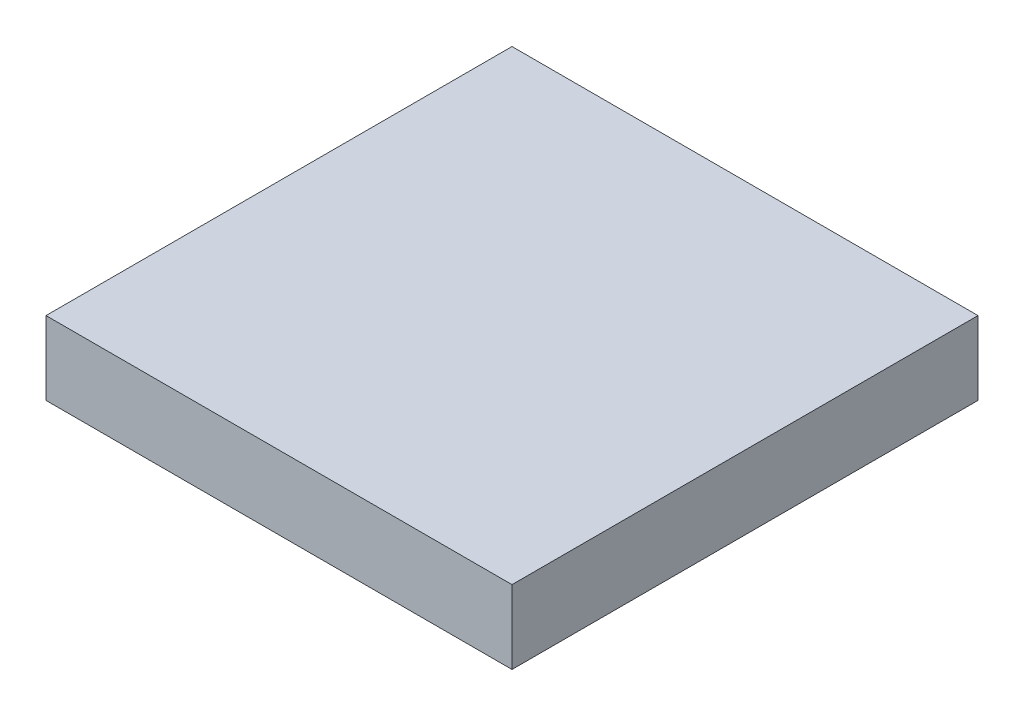
ISO-10303-21;
HEADER;
FILE_DESCRIPTION(('STEP AP214'),'2;1');
FILE_NAME('part.step','',(''),(''),'','','');
FILE_SCHEMA(('AUTOMOTIVE_DESIGN { 1 0 10303 214 1 1 1 1 }'));
ENDSEC;
DATA;
#1=APPLICATION_CONTEXT('core data for automotive mechanical design processes');
#2=APPLICATION_PROTOCOL_DEFINITION('international standard','automotive_design',2000,#1);
#3=PRODUCT_CONTEXT('',#1,'mechanical');
#4=PRODUCT('Part','Part','',(#3));
#5=PRODUCT_RELATED_PRODUCT_CATEGORY('part','',(#4));
#6=PRODUCT_DEFINITION_FORMATION('','',#4);
#7=PRODUCT_DEFINITION_CONTEXT('part definition',#1,'design');
#8=PRODUCT_DEFINITION('design','',#6,#7);
#9=PRODUCT_DEFINITION_SHAPE('','',#8);
#10=(LENGTH_UNIT() NAMED_UNIT(*) SI_UNIT(.MILLI.,.METRE.));
#11=(NAMED_UNIT(*) PLANE_ANGLE_UNIT() SI_UNIT($,.RADIAN.));
#12=(NAMED_UNIT(*) SI_UNIT($,.STERADIAN.) SOLID_ANGLE_UNIT());
#13=UNCERTAINTY_MEASURE_WITH_UNIT(LENGTH_MEASURE(1.E-05),#10,'distance_accuracy_value','');
#14=(GEOMETRIC_REPRESENTATION_CONTEXT(3) GLOBAL_UNCERTAINTY_ASSIGNED_CONTEXT((#13)) GLOBAL_UNIT_ASSIGNED_CONTEXT((#10,
#11,#12)) REPRESENTATION_CONTEXT('',''));
#15=CARTESIAN_POINT('',(0.,0.,0.));
#16=DIRECTION('',(0.,0.,1.));
#17=DIRECTION('',(1.,0.,0.));
#18=AXIS2_PLACEMENT_3D('',#15,#16,#17);
#19=CARTESIAN_POINT('',(14.9,4.7,14.9));
#20=DIRECTION('',(-1.,0.,0.));
#21=DIRECTION('',(0.,0.,1.));
#22=AXIS2_PLACEMENT_3D('',#19,#20,#21);
#23=PLANE('',#22);
#24=DIRECTION('',(0.,0.,-1.));
#25=VECTOR('',#24,1.);
#26=CARTESIAN_POINT('',(14.9,0.,14.9));
#27=LINE('',#26,#25);
#28=CARTESIAN_POINT('',(14.9,0.,14.9));
#29=VERTEX_POINT('',#28);
#30=CARTESIAN_POINT('',(14.9,0.,-14.9));
#31=VERTEX_POINT('',#30);
#32=EDGE_CURVE('E111',#29,#31,#27,.T.);
#33=ORIENTED_EDGE('',*,*,#32,.T.);
#34=DIRECTION('',(0.,-1.,0.));
#35=VECTOR('',#34,1.);
#36=CARTESIAN_POINT('',(14.9,4.7,-14.9));
#37=LINE('',#36,#35);
#38=CARTESIAN_POINT('',(14.9,4.7,-14.9));
#39=VERTEX_POINT('',#38);
#40=EDGE_CURVE('E11',#39,#31,#37,.T.);
#41=ORIENTED_EDGE('',*,*,#40,.F.);
#42=DIRECTION('',(0.,0.,-1.));
#43=VECTOR('',#42,1.);
#44=CARTESIAN_POINT('',(14.9,4.7,14.9));
#45=LINE('',#44,#43);
#46=CARTESIAN_POINT('',(14.9,4.7,14.9));
#47=VERTEX_POINT('',#46);
#48=EDGE_CURVE('E95',#47,#39,#45,.T.);
#49=ORIENTED_EDGE('',*,*,#48,.F.);
#50=DIRECTION('',(0.,-1.,0.));
#51=VECTOR('',#50,1.);
#52=CARTESIAN_POINT('',(14.9,4.7,14.9));
#53=LINE('',#52,#51);
#54=EDGE_CURVE('E107',#47,#29,#53,.T.);
#55=ORIENTED_EDGE('',*,*,#54,.T.);
#56=EDGE_LOOP('',(#33,#41,#49,#55));
#57=FACE_BOUND('',#56,.T.);
#58=ADVANCED_FACE('F43',(#57),#23,.F.);
#59=CARTESIAN_POINT('',(-14.9,4.7,-14.9));
#60=DIRECTION('',(0.,0.,1.));
#61=DIRECTION('',(1.,0.,0.));
#62=AXIS2_PLACEMENT_3D('',#59,#60,#61);
#63=PLANE('',#62);
#64=DIRECTION('',(-1.,0.,0.));
#65=VECTOR('',#64,1.);
#66=CARTESIAN_POINT('',(-14.9,0.,-14.9));
#67=LINE('',#66,#65);
#68=CARTESIAN_POINT('',(-14.9,0.,-14.9));
#69=VERTEX_POINT('',#68);
#70=EDGE_CURVE('E100',#31,#69,#67,.T.);
#71=ORIENTED_EDGE('',*,*,#70,.T.);
#72=DIRECTION('',(0.,-1.,0.));
#73=VECTOR('',#72,1.);
#74=CARTESIAN_POINT('',(-14.9,4.7,-14.9));
#75=LINE('',#74,#73);
#76=CARTESIAN_POINT('',(-14.9,4.7,-14.9));
#77=VERTEX_POINT('',#76);
#78=EDGE_CURVE('E52',#77,#69,#75,.T.);
#79=ORIENTED_EDGE('',*,*,#78,.F.);
#80=DIRECTION('',(-1.,0.,0.));
#81=VECTOR('',#80,1.);
#82=CARTESIAN_POINT('',(-14.9,4.7,-14.9));
#83=LINE('',#82,#81);
#84=EDGE_CURVE('E90',#39,#77,#83,.T.);
#85=ORIENTED_EDGE('',*,*,#84,.F.);
#86=ORIENTED_EDGE('',*,*,#40,.T.);
#87=EDGE_LOOP('',(#71,#79,#85,#86));
#88=FACE_BOUND('',#87,.T.);
#89=ADVANCED_FACE('F99',(#88),#63,.F.);
#90=CARTESIAN_POINT('',(-14.9,4.7,14.9));
#91=DIRECTION('',(1.,0.,0.));
#92=DIRECTION('',(0.,0.,-1.));
#93=AXIS2_PLACEMENT_3D('',#90,#91,#92);
#94=PLANE('',#93);
#95=DIRECTION('',(0.,0.,1.));
#96=VECTOR('',#95,1.);
#97=CARTESIAN_POINT('',(-14.9,0.,14.9));
#98=LINE('',#97,#96);
#99=CARTESIAN_POINT('',(-14.9,0.,14.9));
#100=VERTEX_POINT('',#99);
#101=EDGE_CURVE('E77',#69,#100,#98,.T.);
#102=ORIENTED_EDGE('',*,*,#101,.T.);
#103=DIRECTION('',(0.,-1.,0.));
#104=VECTOR('',#103,1.);
#105=CARTESIAN_POINT('',(-14.9,4.7,14.9));
#106=LINE('',#105,#104);
#107=CARTESIAN_POINT('',(-14.9,4.7,14.9));
#108=VERTEX_POINT('',#107);
#109=EDGE_CURVE('E102',#108,#100,#106,.T.);
#110=ORIENTED_EDGE('',*,*,#109,.F.);
#111=DIRECTION('',(0.,0.,1.));
#112=VECTOR('',#111,1.);
#113=CARTESIAN_POINT('',(-14.9,4.7,14.9));
#114=LINE('',#113,#112);
#115=EDGE_CURVE('E93',#77,#108,#114,.T.);
#116=ORIENTED_EDGE('',*,*,#115,.F.);
#117=ORIENTED_EDGE('',*,*,#78,.T.);
#118=EDGE_LOOP('',(#102,#110,#116,#117));
#119=FACE_BOUND('',#118,.T.);
#120=ADVANCED_FACE('F103',(#119),#94,.F.);
#121=CARTESIAN_POINT('',(-14.9,4.7,14.9));
#122=DIRECTION('',(0.,0.,-1.));
#123=DIRECTION('',(-1.,0.,0.));
#124=AXIS2_PLACEMENT_3D('',#121,#122,#123);
#125=PLANE('',#124);
#126=DIRECTION('',(1.,0.,0.));
#127=VECTOR('',#126,1.);
#128=CARTESIAN_POINT('',(-14.9,0.,14.9));
#129=LINE('',#128,#127);
#130=EDGE_CURVE('E83',#100,#29,#129,.T.);
#131=ORIENTED_EDGE('',*,*,#130,.T.);
#132=ORIENTED_EDGE('',*,*,#54,.F.);
#133=DIRECTION('',(1.,0.,0.));
#134=VECTOR('',#133,1.);
#135=CARTESIAN_POINT('',(-14.9,4.7,14.9));
#136=LINE('',#135,#134);
#137=EDGE_CURVE('E60',#108,#47,#136,.T.);
#138=ORIENTED_EDGE('',*,*,#137,.F.);
#139=ORIENTED_EDGE('',*,*,#109,.T.);
#140=EDGE_LOOP('',(#131,#132,#138,#139));
#141=FACE_BOUND('',#140,.T.);
#142=ADVANCED_FACE('F124',(#141),#125,.F.);
#143=CARTESIAN_POINT('',(0.,4.7,0.));
#144=DIRECTION('',(0.,-1.,0.));
#145=DIRECTION('',(0.,0.,-1.));
#146=AXIS2_PLACEMENT_3D('',#143,#144,#145);
#147=PLANE('',#146);
#148=ORIENTED_EDGE('',*,*,#48,.T.);
#149=ORIENTED_EDGE('',*,*,#84,.T.);
#150=ORIENTED_EDGE('',*,*,#115,.T.);
#151=ORIENTED_EDGE('',*,*,#137,.T.);
#152=EDGE_LOOP('',(#148,#149,#150,#151));
#153=FACE_BOUND('',#152,.T.);
#154=ADVANCED_FACE('F91',(#153),#147,.F.);
#155=CARTESIAN_POINT('',(0.,0.,0.));
#156=DIRECTION('',(0.,-1.,0.));
#157=DIRECTION('',(0.,0.,-1.));
#158=AXIS2_PLACEMENT_3D('',#155,#156,#157);
#159=PLANE('',#158);
#160=ORIENTED_EDGE('',*,*,#32,.F.);
#161=ORIENTED_EDGE('',*,*,#130,.F.);
#162=ORIENTED_EDGE('',*,*,#101,.F.);
#163=ORIENTED_EDGE('',*,*,#70,.F.);
#164=EDGE_LOOP('',(#160,#161,#162,#163));
#165=FACE_BOUND('',#164,.T.);
#166=ADVANCED_FACE('F127',(#165),#159,.T.);
#167=CLOSED_SHELL('',(#58,#89,#120,#142,#154,#166));
#168=MANIFOLD_SOLID_BREP('B2',#167);
#169=ADVANCED_BREP_SHAPE_REPRESENTATION('',(#18,#168),#14);
#170=SHAPE_DEFINITION_REPRESENTATION(#9,#169);
ENDSEC;
END-ISO-10303-21;
